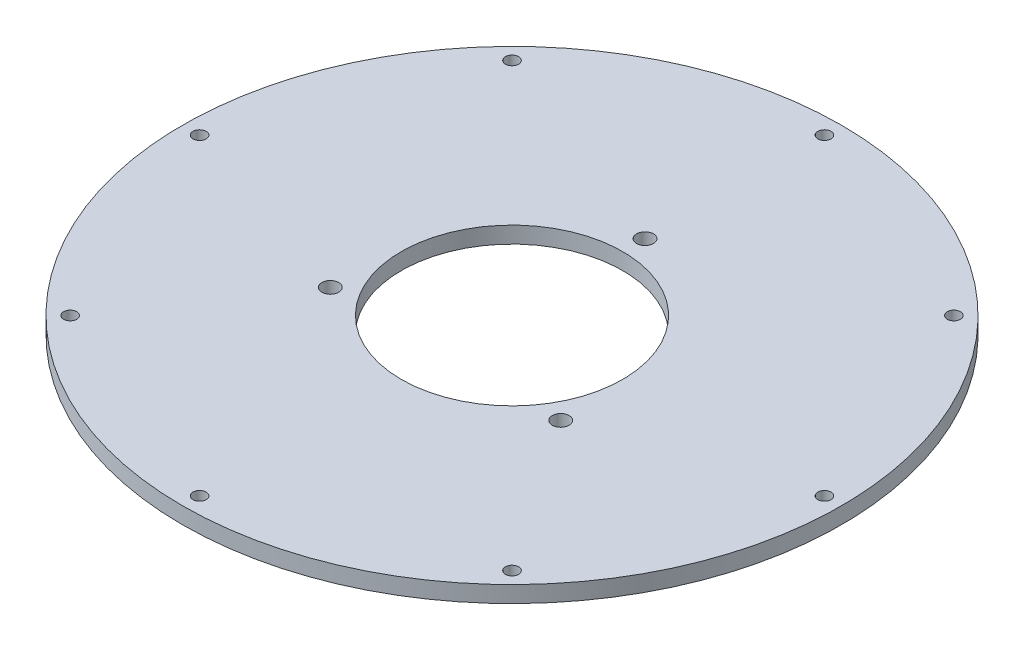
ISO-10303-21;
HEADER;
FILE_DESCRIPTION(('STEP AP214'),'2;1');
FILE_NAME('part.step','',(''),(''),'','','');
FILE_SCHEMA(('AUTOMOTIVE_DESIGN { 1 0 10303 214 1 1 1 1 }'));
ENDSEC;
DATA;
#1=APPLICATION_CONTEXT('core data for automotive mechanical design processes');
#2=APPLICATION_PROTOCOL_DEFINITION('international standard','automotive_design',2000,#1);
#3=PRODUCT_CONTEXT('',#1,'mechanical');
#4=PRODUCT('Part','Part','',(#3));
#5=PRODUCT_RELATED_PRODUCT_CATEGORY('part','',(#4));
#6=PRODUCT_DEFINITION_FORMATION('','',#4);
#7=PRODUCT_DEFINITION_CONTEXT('part definition',#1,'design');
#8=PRODUCT_DEFINITION('design','',#6,#7);
#9=PRODUCT_DEFINITION_SHAPE('','',#8);
#10=(LENGTH_UNIT() NAMED_UNIT(*) SI_UNIT(.MILLI.,.METRE.));
#11=(NAMED_UNIT(*) PLANE_ANGLE_UNIT() SI_UNIT($,.RADIAN.));
#12=(NAMED_UNIT(*) SI_UNIT($,.STERADIAN.) SOLID_ANGLE_UNIT());
#13=UNCERTAINTY_MEASURE_WITH_UNIT(LENGTH_MEASURE(1.E-05),#10,'distance_accuracy_value','');
#14=(GEOMETRIC_REPRESENTATION_CONTEXT(3) GLOBAL_UNCERTAINTY_ASSIGNED_CONTEXT((#13)) GLOBAL_UNIT_ASSIGNED_CONTEXT((#10,
#11,#12)) REPRESENTATION_CONTEXT('',''));
#15=CARTESIAN_POINT('',(0.,0.,0.));
#16=DIRECTION('',(0.,0.,1.));
#17=DIRECTION('',(1.,0.,0.));
#18=AXIS2_PLACEMENT_3D('',#15,#16,#17);
#19=CARTESIAN_POINT('',(0.,3.125,0.));
#20=DIRECTION('',(0.,1.,0.));
#21=DIRECTION('',(0.,0.,1.));
#22=AXIS2_PLACEMENT_3D('',#19,#20,#21);
#23=PLANE('',#22);
#24=CARTESIAN_POINT('',(-59.25,3.125,0.));
#25=DIRECTION('',(0.,1.,0.));
#26=DIRECTION('',(0.,0.,1.));
#27=AXIS2_PLACEMENT_3D('',#24,#25,#26);
#28=CIRCLE('',#27,1.25);
#29=CARTESIAN_POINT('',(-59.25,3.125,1.25000000000001));
#30=VERTEX_POINT('',#29);
#31=EDGE_CURVE('E95',#30,#30,#28,.T.);
#32=ORIENTED_EDGE('',*,*,#31,.F.);
#33=EDGE_LOOP('',(#32));
#34=FACE_BOUND('',#33,.T.);
#35=CARTESIAN_POINT('',(41.8960767853029,3.125,41.8960767853029));
#36=DIRECTION('',(0.,1.,0.));
#37=DIRECTION('',(0.,0.,1.));
#38=AXIS2_PLACEMENT_3D('',#35,#36,#37);
#39=CIRCLE('',#38,1.25);
#40=CARTESIAN_POINT('',(41.8960767853029,3.125,43.146076785303));
#41=VERTEX_POINT('',#40);
#42=EDGE_CURVE('E84',#41,#41,#39,.T.);
#43=ORIENTED_EDGE('',*,*,#42,.F.);
#44=EDGE_LOOP('',(#43));
#45=FACE_BOUND('',#44,.T.);
#46=CARTESIAN_POINT('',(-41.8960767853029,3.125,41.8960767853029));
#47=DIRECTION('',(0.,1.,0.));
#48=DIRECTION('',(0.,0.,1.));
#49=AXIS2_PLACEMENT_3D('',#46,#47,#48);
#50=CIRCLE('',#49,1.25);
#51=CARTESIAN_POINT('',(-41.8960767853029,3.125,43.1460767853029));
#52=VERTEX_POINT('',#51);
#53=EDGE_CURVE('E83',#52,#52,#50,.T.);
#54=ORIENTED_EDGE('',*,*,#53,.F.);
#55=EDGE_LOOP('',(#54));
#56=FACE_BOUND('',#55,.T.);
#57=CARTESIAN_POINT('',(41.8960767853029,3.125,-41.8960767853029));
#58=DIRECTION('',(0.,1.,0.));
#59=DIRECTION('',(0.,0.,1.));
#60=AXIS2_PLACEMENT_3D('',#57,#58,#59);
#61=CIRCLE('',#60,1.25);
#62=CARTESIAN_POINT('',(41.8960767853029,3.125,-40.6460767853029));
#63=VERTEX_POINT('',#62);
#64=EDGE_CURVE('E77',#63,#63,#61,.T.);
#65=ORIENTED_EDGE('',*,*,#64,.F.);
#66=EDGE_LOOP('',(#65));
#67=FACE_BOUND('',#66,.T.);
#68=CARTESIAN_POINT('',(59.25,3.125,0.));
#69=DIRECTION('',(0.,1.,0.));
#70=DIRECTION('',(0.,0.,1.));
#71=AXIS2_PLACEMENT_3D('',#68,#69,#70);
#72=CIRCLE('',#71,1.25);
#73=CARTESIAN_POINT('',(59.25,3.125,1.24999999999997));
#74=VERTEX_POINT('',#73);
#75=EDGE_CURVE('E96',#74,#74,#72,.T.);
#76=ORIENTED_EDGE('',*,*,#75,.F.);
#77=EDGE_LOOP('',(#76));
#78=FACE_BOUND('',#77,.T.);
#79=CARTESIAN_POINT('',(0.,3.125,-59.25));
#80=DIRECTION('',(0.,1.,0.));
#81=DIRECTION('',(0.,0.,1.));
#82=AXIS2_PLACEMENT_3D('',#79,#80,#81);
#83=CIRCLE('',#82,1.25);
#84=CARTESIAN_POINT('',(0.,3.125,-58.));
#85=VERTEX_POINT('',#84);
#86=EDGE_CURVE('E113',#85,#85,#83,.T.);
#87=ORIENTED_EDGE('',*,*,#86,.F.);
#88=EDGE_LOOP('',(#87));
#89=FACE_BOUND('',#88,.T.);
#90=CARTESIAN_POINT('',(0.,3.125,59.25));
#91=DIRECTION('',(0.,1.,0.));
#92=DIRECTION('',(0.,0.,1.));
#93=AXIS2_PLACEMENT_3D('',#90,#91,#92);
#94=CIRCLE('',#93,1.25);
#95=CARTESIAN_POINT('',(0.,3.125,60.5));
#96=VERTEX_POINT('',#95);
#97=EDGE_CURVE('E107',#96,#96,#94,.T.);
#98=ORIENTED_EDGE('',*,*,#97,.F.);
#99=EDGE_LOOP('',(#98));
#100=FACE_BOUND('',#99,.T.);
#101=CARTESIAN_POINT('',(-41.8960767853029,3.125,-41.8960767853029));
#102=DIRECTION('',(0.,1.,0.));
#103=DIRECTION('',(0.,0.,1.));
#104=AXIS2_PLACEMENT_3D('',#101,#102,#103);
#105=CIRCLE('',#104,1.25);
#106=CARTESIAN_POINT('',(-41.8960767853029,3.125,-40.6460767853029));
#107=VERTEX_POINT('',#106);
#108=EDGE_CURVE('E74',#107,#107,#105,.T.);
#109=ORIENTED_EDGE('',*,*,#108,.F.);
#110=EDGE_LOOP('',(#109));
#111=FACE_BOUND('',#110,.T.);
#112=CARTESIAN_POINT('',(1.39851845382122E-13,3.125,-25.225));
#113=DIRECTION('',(0.,1.,0.));
#114=DIRECTION('',(0.,0.,1.));
#115=AXIS2_PLACEMENT_3D('',#112,#113,#114);
#116=CIRCLE('',#115,1.6);
#117=CARTESIAN_POINT('',(1.39851845382122E-13,3.125,-23.625));
#118=VERTEX_POINT('',#117);
#119=EDGE_CURVE('E69',#118,#118,#116,.T.);
#120=ORIENTED_EDGE('',*,*,#119,.F.);
#121=EDGE_LOOP('',(#120));
#122=FACE_BOUND('',#121,.T.);
#123=CARTESIAN_POINT('',(21.8454908104624,3.125,12.6125000000001));
#124=DIRECTION('',(0.,1.,0.));
#125=DIRECTION('',(0.,0.,1.));
#126=AXIS2_PLACEMENT_3D('',#123,#124,#125);
#127=CIRCLE('',#126,1.6);
#128=CARTESIAN_POINT('',(21.8454908104624,3.125,14.2125000000001));
#129=VERTEX_POINT('',#128);
#130=EDGE_CURVE('E66',#129,#129,#127,.T.);
#131=ORIENTED_EDGE('',*,*,#130,.F.);
#132=EDGE_LOOP('',(#131));
#133=FACE_BOUND('',#132,.T.);
#134=CARTESIAN_POINT('',(-21.8454908104626,3.125,12.6124999999999));
#135=DIRECTION('',(0.,1.,0.));
#136=DIRECTION('',(0.,0.,1.));
#137=AXIS2_PLACEMENT_3D('',#134,#135,#136);
#138=CIRCLE('',#137,1.6);
#139=CARTESIAN_POINT('',(-21.8454908104626,3.125,14.2124999999999));
#140=VERTEX_POINT('',#139);
#141=EDGE_CURVE('E59',#140,#140,#138,.T.);
#142=ORIENTED_EDGE('',*,*,#141,.F.);
#143=EDGE_LOOP('',(#142));
#144=FACE_BOUND('',#143,.T.);
#145=CARTESIAN_POINT('',(0.,3.125,0.));
#146=DIRECTION('',(0.,1.,0.));
#147=DIRECTION('',(0.,0.,1.));
#148=AXIS2_PLACEMENT_3D('',#145,#146,#147);
#149=CIRCLE('',#148,62.5);
#150=CARTESIAN_POINT('',(0.,3.125,62.5));
#151=VERTEX_POINT('',#150);
#152=EDGE_CURVE('E10',#151,#151,#149,.T.);
#153=ORIENTED_EDGE('',*,*,#152,.T.);
#154=EDGE_LOOP('',(#153));
#155=FACE_BOUND('',#154,.T.);
#156=CARTESIAN_POINT('',(0.,3.125,0.));
#157=DIRECTION('',(0.,1.,0.));
#158=DIRECTION('',(0.,0.,1.));
#159=AXIS2_PLACEMENT_3D('',#156,#157,#158);
#160=CIRCLE('',#159,21.);
#161=CARTESIAN_POINT('',(0.,3.125,21.));
#162=VERTEX_POINT('',#161);
#163=EDGE_CURVE('E48',#162,#162,#160,.T.);
#164=ORIENTED_EDGE('',*,*,#163,.F.);
#165=EDGE_LOOP('',(#164));
#166=FACE_BOUND('',#165,.T.);
#167=ADVANCED_FACE('F37',(#34,#45,#56,#67,#78,#89,#100,#111,#122,#133,#144,#155,#166),#23,.T.);
#168=CARTESIAN_POINT('',(0.,0.,0.));
#169=DIRECTION('',(0.,1.,0.));
#170=DIRECTION('',(0.,0.,1.));
#171=AXIS2_PLACEMENT_3D('',#168,#169,#170);
#172=PLANE('',#171);
#173=CARTESIAN_POINT('',(-59.25,0.,0.));
#174=DIRECTION('',(0.,1.,0.));
#175=DIRECTION('',(0.,0.,1.));
#176=AXIS2_PLACEMENT_3D('',#173,#174,#175);
#177=CIRCLE('',#176,1.25);
#178=CARTESIAN_POINT('',(-59.25,0.,1.25000000000001));
#179=VERTEX_POINT('',#178);
#180=EDGE_CURVE('E92',#179,#179,#177,.T.);
#181=ORIENTED_EDGE('',*,*,#180,.T.);
#182=EDGE_LOOP('',(#181));
#183=FACE_BOUND('',#182,.T.);
#184=CARTESIAN_POINT('',(41.8960767853029,0.,41.8960767853029));
#185=DIRECTION('',(0.,1.,0.));
#186=DIRECTION('',(0.,0.,1.));
#187=AXIS2_PLACEMENT_3D('',#184,#185,#186);
#188=CIRCLE('',#187,1.25);
#189=CARTESIAN_POINT('',(41.8960767853029,0.,43.146076785303));
#190=VERTEX_POINT('',#189);
#191=EDGE_CURVE('E99',#190,#190,#188,.T.);
#192=ORIENTED_EDGE('',*,*,#191,.T.);
#193=EDGE_LOOP('',(#192));
#194=FACE_BOUND('',#193,.T.);
#195=CARTESIAN_POINT('',(-41.8960767853029,0.,41.8960767853029));
#196=DIRECTION('',(0.,1.,0.));
#197=DIRECTION('',(0.,0.,1.));
#198=AXIS2_PLACEMENT_3D('',#195,#196,#197);
#199=CIRCLE('',#198,1.25);
#200=CARTESIAN_POINT('',(-41.8960767853029,0.,43.1460767853029));
#201=VERTEX_POINT('',#200);
#202=EDGE_CURVE('E80',#201,#201,#199,.T.);
#203=ORIENTED_EDGE('',*,*,#202,.T.);
#204=EDGE_LOOP('',(#203));
#205=FACE_BOUND('',#204,.T.);
#206=CARTESIAN_POINT('',(41.8960767853029,0.,-41.8960767853029));
#207=DIRECTION('',(0.,1.,0.));
#208=DIRECTION('',(0.,0.,1.));
#209=AXIS2_PLACEMENT_3D('',#206,#207,#208);
#210=CIRCLE('',#209,1.25);
#211=CARTESIAN_POINT('',(41.8960767853029,0.,-40.6460767853029));
#212=VERTEX_POINT('',#211);
#213=EDGE_CURVE('E87',#212,#212,#210,.T.);
#214=ORIENTED_EDGE('',*,*,#213,.T.);
#215=EDGE_LOOP('',(#214));
#216=FACE_BOUND('',#215,.T.);
#217=CARTESIAN_POINT('',(59.25,0.,0.));
#218=DIRECTION('',(0.,1.,0.));
#219=DIRECTION('',(0.,0.,1.));
#220=AXIS2_PLACEMENT_3D('',#217,#218,#219);
#221=CIRCLE('',#220,1.25);
#222=CARTESIAN_POINT('',(59.25,0.,1.24999999999997));
#223=VERTEX_POINT('',#222);
#224=EDGE_CURVE('E116',#223,#223,#221,.T.);
#225=ORIENTED_EDGE('',*,*,#224,.T.);
#226=EDGE_LOOP('',(#225));
#227=FACE_BOUND('',#226,.T.);
#228=CARTESIAN_POINT('',(0.,0.,-59.25));
#229=DIRECTION('',(0.,1.,0.));
#230=DIRECTION('',(0.,0.,1.));
#231=AXIS2_PLACEMENT_3D('',#228,#229,#230);
#232=CIRCLE('',#231,1.25);
#233=CARTESIAN_POINT('',(0.,0.,-58.));
#234=VERTEX_POINT('',#233);
#235=EDGE_CURVE('E110',#234,#234,#232,.T.);
#236=ORIENTED_EDGE('',*,*,#235,.T.);
#237=EDGE_LOOP('',(#236));
#238=FACE_BOUND('',#237,.T.);
#239=CARTESIAN_POINT('',(0.,0.,59.25));
#240=DIRECTION('',(0.,1.,0.));
#241=DIRECTION('',(0.,0.,1.));
#242=AXIS2_PLACEMENT_3D('',#239,#240,#241);
#243=CIRCLE('',#242,1.25);
#244=CARTESIAN_POINT('',(0.,0.,60.5));
#245=VERTEX_POINT('',#244);
#246=EDGE_CURVE('E104',#245,#245,#243,.T.);
#247=ORIENTED_EDGE('',*,*,#246,.T.);
#248=EDGE_LOOP('',(#247));
#249=FACE_BOUND('',#248,.T.);
#250=CARTESIAN_POINT('',(-41.8960767853029,0.,-41.8960767853029));
#251=DIRECTION('',(0.,1.,0.));
#252=DIRECTION('',(0.,0.,1.));
#253=AXIS2_PLACEMENT_3D('',#250,#251,#252);
#254=CIRCLE('',#253,1.25);
#255=CARTESIAN_POINT('',(-41.8960767853029,0.,-40.6460767853029));
#256=VERTEX_POINT('',#255);
#257=EDGE_CURVE('E60',#256,#256,#254,.T.);
#258=ORIENTED_EDGE('',*,*,#257,.T.);
#259=EDGE_LOOP('',(#258));
#260=FACE_BOUND('',#259,.T.);
#261=CARTESIAN_POINT('',(1.39851845382122E-13,0.,-25.225));
#262=DIRECTION('',(0.,1.,0.));
#263=DIRECTION('',(0.,0.,1.));
#264=AXIS2_PLACEMENT_3D('',#261,#262,#263);
#265=CIRCLE('',#264,1.6);
#266=CARTESIAN_POINT('',(1.39851845382122E-13,0.,-23.625));
#267=VERTEX_POINT('',#266);
#268=EDGE_CURVE('E53',#267,#267,#265,.T.);
#269=ORIENTED_EDGE('',*,*,#268,.T.);
#270=EDGE_LOOP('',(#269));
#271=FACE_BOUND('',#270,.T.);
#272=CARTESIAN_POINT('',(21.8454908104624,0.,12.6125000000001));
#273=DIRECTION('',(0.,1.,0.));
#274=DIRECTION('',(0.,0.,1.));
#275=AXIS2_PLACEMENT_3D('',#272,#273,#274);
#276=CIRCLE('',#275,1.6);
#277=CARTESIAN_POINT('',(21.8454908104624,0.,14.2125000000001));
#278=VERTEX_POINT('',#277);
#279=EDGE_CURVE('E63',#278,#278,#276,.T.);
#280=ORIENTED_EDGE('',*,*,#279,.T.);
#281=EDGE_LOOP('',(#280));
#282=FACE_BOUND('',#281,.T.);
#283=CARTESIAN_POINT('',(-21.8454908104626,0.,12.6124999999999));
#284=DIRECTION('',(0.,1.,0.));
#285=DIRECTION('',(0.,0.,1.));
#286=AXIS2_PLACEMENT_3D('',#283,#284,#285);
#287=CIRCLE('',#286,1.6);
#288=CARTESIAN_POINT('',(-21.8454908104626,0.,14.2124999999999));
#289=VERTEX_POINT('',#288);
#290=EDGE_CURVE('E56',#289,#289,#287,.T.);
#291=ORIENTED_EDGE('',*,*,#290,.T.);
#292=EDGE_LOOP('',(#291));
#293=FACE_BOUND('',#292,.T.);
#294=CARTESIAN_POINT('',(0.,0.,0.));
#295=DIRECTION('',(0.,1.,0.));
#296=DIRECTION('',(0.,0.,1.));
#297=AXIS2_PLACEMENT_3D('',#294,#295,#296);
#298=CIRCLE('',#297,62.5);
#299=CARTESIAN_POINT('',(0.,0.,62.5));
#300=VERTEX_POINT('',#299);
#301=EDGE_CURVE('E41',#300,#300,#298,.T.);
#302=ORIENTED_EDGE('',*,*,#301,.F.);
#303=EDGE_LOOP('',(#302));
#304=FACE_BOUND('',#303,.T.);
#305=CARTESIAN_POINT('',(0.,0.,0.));
#306=DIRECTION('',(0.,1.,0.));
#307=DIRECTION('',(0.,0.,1.));
#308=AXIS2_PLACEMENT_3D('',#305,#306,#307);
#309=CIRCLE('',#308,21.);
#310=CARTESIAN_POINT('',(0.,0.,21.));
#311=VERTEX_POINT('',#310);
#312=EDGE_CURVE('E50',#311,#311,#309,.T.);
#313=ORIENTED_EDGE('',*,*,#312,.T.);
#314=EDGE_LOOP('',(#313));
#315=FACE_BOUND('',#314,.T.);
#316=ADVANCED_FACE('F126',(#183,#194,#205,#216,#227,#238,#249,#260,#271,#282,#293,#304,#315),
#172,.F.);
#317=CARTESIAN_POINT('',(0.,3.125,0.));
#318=DIRECTION('',(0.,-1.,0.));
#319=DIRECTION('',(0.,0.,-1.));
#320=AXIS2_PLACEMENT_3D('',#317,#318,#319);
#321=CYLINDRICAL_SURFACE('',#320,62.5);
#322=ORIENTED_EDGE('',*,*,#152,.F.);
#323=EDGE_LOOP('',(#322));
#324=FACE_BOUND('',#323,.T.);
#325=ORIENTED_EDGE('',*,*,#301,.T.);
#326=EDGE_LOOP('',(#325));
#327=FACE_BOUND('',#326,.T.);
#328=ADVANCED_FACE('F39',(#324,#327),#321,.T.);
#329=CARTESIAN_POINT('',(0.,3.125,0.));
#330=DIRECTION('',(0.,-1.,0.));
#331=DIRECTION('',(0.,0.,-1.));
#332=AXIS2_PLACEMENT_3D('',#329,#330,#331);
#333=CYLINDRICAL_SURFACE('',#332,21.);
#334=ORIENTED_EDGE('',*,*,#163,.T.);
#335=EDGE_LOOP('',(#334));
#336=FACE_BOUND('',#335,.T.);
#337=ORIENTED_EDGE('',*,*,#312,.F.);
#338=EDGE_LOOP('',(#337));
#339=FACE_BOUND('',#338,.T.);
#340=ADVANCED_FACE('F143',(#336,#339),#333,.F.);
#341=CARTESIAN_POINT('',(-21.8454908104626,0.,12.6124999999999));
#342=DIRECTION('',(0.,1.,0.));
#343=DIRECTION('',(0.,0.,1.));
#344=AXIS2_PLACEMENT_3D('',#341,#342,#343);
#345=CYLINDRICAL_SURFACE('',#344,1.6);
#346=ORIENTED_EDGE('',*,*,#290,.F.);
#347=EDGE_LOOP('',(#346));
#348=FACE_BOUND('',#347,.T.);
#349=ORIENTED_EDGE('',*,*,#141,.T.);
#350=EDGE_LOOP('',(#349));
#351=FACE_BOUND('',#350,.T.);
#352=ADVANCED_FACE('F146',(#348,#351),#345,.F.);
#353=CARTESIAN_POINT('',(21.8454908104624,0.,12.6125000000001));
#354=DIRECTION('',(0.,1.,0.));
#355=DIRECTION('',(0.,0.,1.));
#356=AXIS2_PLACEMENT_3D('',#353,#354,#355);
#357=CYLINDRICAL_SURFACE('',#356,1.6);
#358=ORIENTED_EDGE('',*,*,#279,.F.);
#359=EDGE_LOOP('',(#358));
#360=FACE_BOUND('',#359,.T.);
#361=ORIENTED_EDGE('',*,*,#130,.T.);
#362=EDGE_LOOP('',(#361));
#363=FACE_BOUND('',#362,.T.);
#364=ADVANCED_FACE('F161',(#360,#363),#357,.F.);
#365=CARTESIAN_POINT('',(1.39851845382122E-13,0.,-25.225));
#366=DIRECTION('',(0.,1.,0.));
#367=DIRECTION('',(0.,0.,1.));
#368=AXIS2_PLACEMENT_3D('',#365,#366,#367);
#369=CYLINDRICAL_SURFACE('',#368,1.6);
#370=ORIENTED_EDGE('',*,*,#268,.F.);
#371=EDGE_LOOP('',(#370));
#372=FACE_BOUND('',#371,.T.);
#373=ORIENTED_EDGE('',*,*,#119,.T.);
#374=EDGE_LOOP('',(#373));
#375=FACE_BOUND('',#374,.T.);
#376=ADVANCED_FACE('F165',(#372,#375),#369,.F.);
#377=CARTESIAN_POINT('',(-41.8960767853029,0.,-41.8960767853029));
#378=DIRECTION('',(0.,1.,0.));
#379=DIRECTION('',(0.,0.,1.));
#380=AXIS2_PLACEMENT_3D('',#377,#378,#379);
#381=CYLINDRICAL_SURFACE('',#380,1.25);
#382=ORIENTED_EDGE('',*,*,#257,.F.);
#383=EDGE_LOOP('',(#382));
#384=FACE_BOUND('',#383,.T.);
#385=ORIENTED_EDGE('',*,*,#108,.T.);
#386=EDGE_LOOP('',(#385));
#387=FACE_BOUND('',#386,.T.);
#388=ADVANCED_FACE('F169',(#384,#387),#381,.F.);
#389=CARTESIAN_POINT('',(0.,0.,59.25));
#390=DIRECTION('',(0.,1.,0.));
#391=DIRECTION('',(0.,0.,1.));
#392=AXIS2_PLACEMENT_3D('',#389,#390,#391);
#393=CYLINDRICAL_SURFACE('',#392,1.25);
#394=ORIENTED_EDGE('',*,*,#246,.F.);
#395=EDGE_LOOP('',(#394));
#396=FACE_BOUND('',#395,.T.);
#397=ORIENTED_EDGE('',*,*,#97,.T.);
#398=EDGE_LOOP('',(#397));
#399=FACE_BOUND('',#398,.T.);
#400=ADVANCED_FACE('F172',(#396,#399),#393,.F.);
#401=CARTESIAN_POINT('',(0.,0.,-59.25));
#402=DIRECTION('',(0.,1.,0.));
#403=DIRECTION('',(0.,0.,1.));
#404=AXIS2_PLACEMENT_3D('',#401,#402,#403);
#405=CYLINDRICAL_SURFACE('',#404,1.25);
#406=ORIENTED_EDGE('',*,*,#235,.F.);
#407=EDGE_LOOP('',(#406));
#408=FACE_BOUND('',#407,.T.);
#409=ORIENTED_EDGE('',*,*,#86,.T.);
#410=EDGE_LOOP('',(#409));
#411=FACE_BOUND('',#410,.T.);
#412=ADVANCED_FACE('F192',(#408,#411),#405,.F.);
#413=CARTESIAN_POINT('',(59.25,0.,0.));
#414=DIRECTION('',(0.,1.,0.));
#415=DIRECTION('',(0.,0.,1.));
#416=AXIS2_PLACEMENT_3D('',#413,#414,#415);
#417=CYLINDRICAL_SURFACE('',#416,1.25);
#418=ORIENTED_EDGE('',*,*,#224,.F.);
#419=EDGE_LOOP('',(#418));
#420=FACE_BOUND('',#419,.T.);
#421=ORIENTED_EDGE('',*,*,#75,.T.);
#422=EDGE_LOOP('',(#421));
#423=FACE_BOUND('',#422,.T.);
#424=ADVANCED_FACE('F122',(#420,#423),#417,.F.);
#425=CARTESIAN_POINT('',(41.8960767853029,0.,-41.8960767853029));
#426=DIRECTION('',(0.,1.,0.));
#427=DIRECTION('',(0.,0.,1.));
#428=AXIS2_PLACEMENT_3D('',#425,#426,#427);
#429=CYLINDRICAL_SURFACE('',#428,1.25);
#430=ORIENTED_EDGE('',*,*,#213,.F.);
#431=EDGE_LOOP('',(#430));
#432=FACE_BOUND('',#431,.T.);
#433=ORIENTED_EDGE('',*,*,#64,.T.);
#434=EDGE_LOOP('',(#433));
#435=FACE_BOUND('',#434,.T.);
#436=ADVANCED_FACE('F178',(#432,#435),#429,.F.);
#437=CARTESIAN_POINT('',(-41.8960767853029,0.,41.8960767853029));
#438=DIRECTION('',(0.,1.,0.));
#439=DIRECTION('',(0.,0.,1.));
#440=AXIS2_PLACEMENT_3D('',#437,#438,#439);
#441=CYLINDRICAL_SURFACE('',#440,1.25);
#442=ORIENTED_EDGE('',*,*,#202,.F.);
#443=EDGE_LOOP('',(#442));
#444=FACE_BOUND('',#443,.T.);
#445=ORIENTED_EDGE('',*,*,#53,.T.);
#446=EDGE_LOOP('',(#445));
#447=FACE_BOUND('',#446,.T.);
#448=ADVANCED_FACE('F174',(#444,#447),#441,.F.);
#449=CARTESIAN_POINT('',(41.8960767853029,0.,41.8960767853029));
#450=DIRECTION('',(0.,1.,0.));
#451=DIRECTION('',(0.,0.,1.));
#452=AXIS2_PLACEMENT_3D('',#449,#450,#451);
#453=CYLINDRICAL_SURFACE('',#452,1.25);
#454=ORIENTED_EDGE('',*,*,#191,.F.);
#455=EDGE_LOOP('',(#454));
#456=FACE_BOUND('',#455,.T.);
#457=ORIENTED_EDGE('',*,*,#42,.T.);
#458=EDGE_LOOP('',(#457));
#459=FACE_BOUND('',#458,.T.);
#460=ADVANCED_FACE('F177',(#456,#459),#453,.F.);
#461=CARTESIAN_POINT('',(-59.25,0.,0.));
#462=DIRECTION('',(0.,1.,0.));
#463=DIRECTION('',(0.,0.,1.));
#464=AXIS2_PLACEMENT_3D('',#461,#462,#463);
#465=CYLINDRICAL_SURFACE('',#464,1.25);
#466=ORIENTED_EDGE('',*,*,#180,.F.);
#467=EDGE_LOOP('',(#466));
#468=FACE_BOUND('',#467,.T.);
#469=ORIENTED_EDGE('',*,*,#31,.T.);
#470=EDGE_LOOP('',(#469));
#471=FACE_BOUND('',#470,.T.);
#472=ADVANCED_FACE('F183',(#468,#471),#465,.F.);
#473=CLOSED_SHELL('',(#167,#316,#328,#340,#352,#364,#376,#388,#400,#412,#424,#436,#448,#460,#472));
#474=MANIFOLD_SOLID_BREP('B2',#473);
#475=ADVANCED_BREP_SHAPE_REPRESENTATION('',(#18,#474),#14);
#476=SHAPE_DEFINITION_REPRESENTATION(#9,#475);
ENDSEC;
END-ISO-10303-21;
